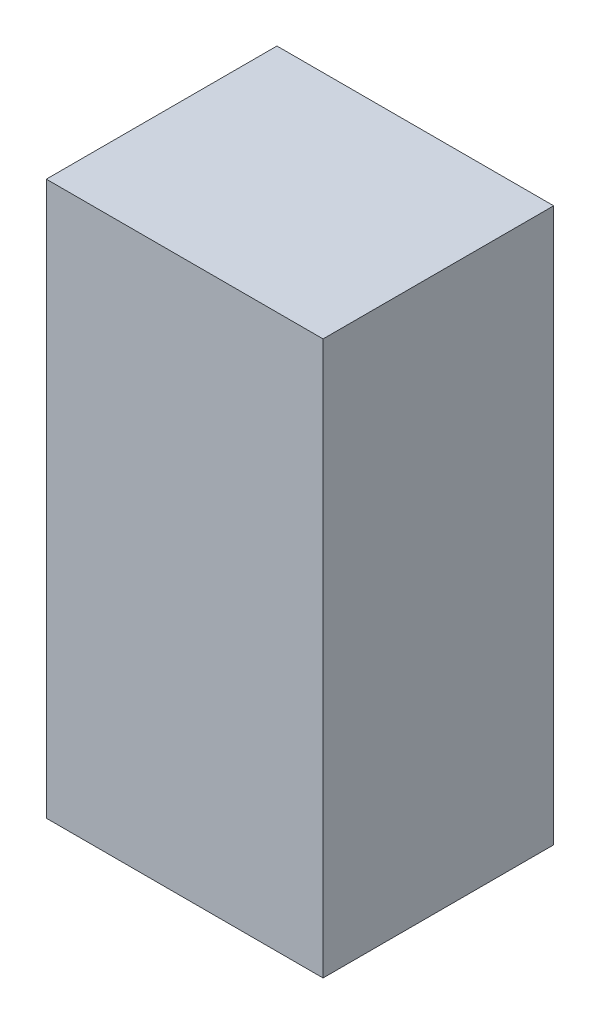
ISO-10303-21;
HEADER;
FILE_DESCRIPTION(('STEP AP214'),'2;1');
FILE_NAME('part.step','',(''),(''),'','','');
FILE_SCHEMA(('AUTOMOTIVE_DESIGN { 1 0 10303 214 1 1 1 1 }'));
ENDSEC;
DATA;
#1=APPLICATION_CONTEXT('core data for automotive mechanical design processes');
#2=APPLICATION_PROTOCOL_DEFINITION('international standard','automotive_design',2000,#1);
#3=PRODUCT_CONTEXT('',#1,'mechanical');
#4=PRODUCT('Part','Part','',(#3));
#5=PRODUCT_RELATED_PRODUCT_CATEGORY('part','',(#4));
#6=PRODUCT_DEFINITION_FORMATION('','',#4);
#7=PRODUCT_DEFINITION_CONTEXT('part definition',#1,'design');
#8=PRODUCT_DEFINITION('design','',#6,#7);
#9=PRODUCT_DEFINITION_SHAPE('','',#8);
#10=(LENGTH_UNIT() NAMED_UNIT(*) SI_UNIT(.MILLI.,.METRE.));
#11=(NAMED_UNIT(*) PLANE_ANGLE_UNIT() SI_UNIT($,.RADIAN.));
#12=(NAMED_UNIT(*) SI_UNIT($,.STERADIAN.) SOLID_ANGLE_UNIT());
#13=UNCERTAINTY_MEASURE_WITH_UNIT(LENGTH_MEASURE(1.E-05),#10,'distance_accuracy_value','');
#14=(GEOMETRIC_REPRESENTATION_CONTEXT(3) GLOBAL_UNCERTAINTY_ASSIGNED_CONTEXT((#13)) GLOBAL_UNIT_ASSIGNED_CONTEXT((#10,
#11,#12)) REPRESENTATION_CONTEXT('',''));
#15=CARTESIAN_POINT('',(0.,0.,0.));
#16=DIRECTION('',(0.,0.,1.));
#17=DIRECTION('',(1.,0.,0.));
#18=AXIS2_PLACEMENT_3D('',#15,#16,#17);
#19=CARTESIAN_POINT('',(-600.,-1200.,500.));
#20=DIRECTION('',(1.,0.,0.));
#21=DIRECTION('',(0.,0.,-1.));
#22=AXIS2_PLACEMENT_3D('',#19,#20,#21);
#23=PLANE('',#22);
#24=DIRECTION('',(0.,-1.,0.));
#25=VECTOR('',#24,1.);
#26=CARTESIAN_POINT('',(-600.,-1200.,-500.));
#27=LINE('',#26,#25);
#28=CARTESIAN_POINT('',(-600.,1200.,-500.));
#29=VERTEX_POINT('',#28);
#30=CARTESIAN_POINT('',(-600.,-1200.,-500.));
#31=VERTEX_POINT('',#30);
#32=EDGE_CURVE('E105',#29,#31,#27,.T.);
#33=ORIENTED_EDGE('',*,*,#32,.T.);
#34=DIRECTION('',(0.,0.,-1.));
#35=VECTOR('',#34,1.);
#36=CARTESIAN_POINT('',(-600.,-1200.,500.));
#37=LINE('',#36,#35);
#38=CARTESIAN_POINT('',(-600.,-1200.,500.));
#39=VERTEX_POINT('',#38);
#40=EDGE_CURVE('E11',#39,#31,#37,.T.);
#41=ORIENTED_EDGE('',*,*,#40,.F.);
#42=DIRECTION('',(0.,-1.,0.));
#43=VECTOR('',#42,1.);
#44=CARTESIAN_POINT('',(-600.,-1200.,500.));
#45=LINE('',#44,#43);
#46=CARTESIAN_POINT('',(-600.,1200.,500.));
#47=VERTEX_POINT('',#46);
#48=EDGE_CURVE('E89',#47,#39,#45,.T.);
#49=ORIENTED_EDGE('',*,*,#48,.F.);
#50=DIRECTION('',(0.,0.,-1.));
#51=VECTOR('',#50,1.);
#52=CARTESIAN_POINT('',(-600.,1200.,500.));
#53=LINE('',#52,#51);
#54=EDGE_CURVE('E98',#47,#29,#53,.T.);
#55=ORIENTED_EDGE('',*,*,#54,.T.);
#56=EDGE_LOOP('',(#33,#41,#49,#55));
#57=FACE_BOUND('',#56,.T.);
#58=ADVANCED_FACE('F39',(#57),#23,.F.);
#59=CARTESIAN_POINT('',(-600.,-1200.,500.));
#60=DIRECTION('',(0.,1.,0.));
#61=DIRECTION('',(0.,0.,1.));
#62=AXIS2_PLACEMENT_3D('',#59,#60,#61);
#63=PLANE('',#62);
#64=DIRECTION('',(1.,0.,0.));
#65=VECTOR('',#64,1.);
#66=CARTESIAN_POINT('',(-600.,-1200.,-500.));
#67=LINE('',#66,#65);
#68=CARTESIAN_POINT('',(600.,-1200.,-500.));
#69=VERTEX_POINT('',#68);
#70=EDGE_CURVE('E94',#31,#69,#67,.T.);
#71=ORIENTED_EDGE('',*,*,#70,.T.);
#72=DIRECTION('',(0.,0.,-1.));
#73=VECTOR('',#72,1.);
#74=CARTESIAN_POINT('',(600.,-1200.,500.));
#75=LINE('',#74,#73);
#76=CARTESIAN_POINT('',(600.,-1200.,500.));
#77=VERTEX_POINT('',#76);
#78=EDGE_CURVE('E50',#77,#69,#75,.T.);
#79=ORIENTED_EDGE('',*,*,#78,.F.);
#80=DIRECTION('',(1.,0.,0.));
#81=VECTOR('',#80,1.);
#82=CARTESIAN_POINT('',(-600.,-1200.,500.));
#83=LINE('',#82,#81);
#84=EDGE_CURVE('E83',#39,#77,#83,.T.);
#85=ORIENTED_EDGE('',*,*,#84,.F.);
#86=ORIENTED_EDGE('',*,*,#40,.T.);
#87=EDGE_LOOP('',(#71,#79,#85,#86));
#88=FACE_BOUND('',#87,.T.);
#89=ADVANCED_FACE('F91',(#88),#63,.F.);
#90=CARTESIAN_POINT('',(600.,-1200.,500.));
#91=DIRECTION('',(-1.,0.,0.));
#92=DIRECTION('',(0.,0.,1.));
#93=AXIS2_PLACEMENT_3D('',#90,#91,#92);
#94=PLANE('',#93);
#95=DIRECTION('',(0.,1.,0.));
#96=VECTOR('',#95,1.);
#97=CARTESIAN_POINT('',(600.,-1200.,-500.));
#98=LINE('',#97,#96);
#99=CARTESIAN_POINT('',(600.,1200.,-500.));
#100=VERTEX_POINT('',#99);
#101=EDGE_CURVE('E75',#69,#100,#98,.T.);
#102=ORIENTED_EDGE('',*,*,#101,.T.);
#103=DIRECTION('',(0.,0.,-1.));
#104=VECTOR('',#103,1.);
#105=CARTESIAN_POINT('',(600.,1200.,500.));
#106=LINE('',#105,#104);
#107=CARTESIAN_POINT('',(600.,1200.,500.));
#108=VERTEX_POINT('',#107);
#109=EDGE_CURVE('E92',#108,#100,#106,.T.);
#110=ORIENTED_EDGE('',*,*,#109,.F.);
#111=DIRECTION('',(0.,1.,0.));
#112=VECTOR('',#111,1.);
#113=CARTESIAN_POINT('',(600.,-1200.,500.));
#114=LINE('',#113,#112);
#115=EDGE_CURVE('E86',#77,#108,#114,.T.);
#116=ORIENTED_EDGE('',*,*,#115,.F.);
#117=ORIENTED_EDGE('',*,*,#78,.T.);
#118=EDGE_LOOP('',(#102,#110,#116,#117));
#119=FACE_BOUND('',#118,.T.);
#120=ADVANCED_FACE('F96',(#119),#94,.F.);
#121=CARTESIAN_POINT('',(-600.,1200.,500.));
#122=DIRECTION('',(0.,-1.,0.));
#123=DIRECTION('',(0.,0.,-1.));
#124=AXIS2_PLACEMENT_3D('',#121,#122,#123);
#125=PLANE('',#124);
#126=DIRECTION('',(-1.,0.,0.));
#127=VECTOR('',#126,1.);
#128=CARTESIAN_POINT('',(-600.,1200.,-500.));
#129=LINE('',#128,#127);
#130=EDGE_CURVE('E79',#100,#29,#129,.T.);
#131=ORIENTED_EDGE('',*,*,#130,.T.);
#132=ORIENTED_EDGE('',*,*,#54,.F.);
#133=DIRECTION('',(-1.,0.,0.));
#134=VECTOR('',#133,1.);
#135=CARTESIAN_POINT('',(-600.,1200.,500.));
#136=LINE('',#135,#134);
#137=EDGE_CURVE('E54',#108,#47,#136,.T.);
#138=ORIENTED_EDGE('',*,*,#137,.F.);
#139=ORIENTED_EDGE('',*,*,#109,.T.);
#140=EDGE_LOOP('',(#131,#132,#138,#139));
#141=FACE_BOUND('',#140,.T.);
#142=ADVANCED_FACE('F108',(#141),#125,.F.);
#143=CARTESIAN_POINT('',(0.,0.,500.));
#144=DIRECTION('',(0.,0.,-1.));
#145=DIRECTION('',(-1.,0.,0.));
#146=AXIS2_PLACEMENT_3D('',#143,#144,#145);
#147=PLANE('',#146);
#148=ORIENTED_EDGE('',*,*,#48,.T.);
#149=ORIENTED_EDGE('',*,*,#84,.T.);
#150=ORIENTED_EDGE('',*,*,#115,.T.);
#151=ORIENTED_EDGE('',*,*,#137,.T.);
#152=EDGE_LOOP('',(#148,#149,#150,#151));
#153=FACE_BOUND('',#152,.T.);
#154=ADVANCED_FACE('F88',(#153),#147,.F.);
#155=CARTESIAN_POINT('',(0.,0.,-500.));
#156=DIRECTION('',(0.,0.,-1.));
#157=DIRECTION('',(-1.,0.,0.));
#158=AXIS2_PLACEMENT_3D('',#155,#156,#157);
#159=PLANE('',#158);
#160=ORIENTED_EDGE('',*,*,#32,.F.);
#161=ORIENTED_EDGE('',*,*,#130,.F.);
#162=ORIENTED_EDGE('',*,*,#101,.F.);
#163=ORIENTED_EDGE('',*,*,#70,.F.);
#164=EDGE_LOOP('',(#160,#161,#162,#163));
#165=FACE_BOUND('',#164,.T.);
#166=ADVANCED_FACE('F115',(#165),#159,.T.);
#167=CLOSED_SHELL('',(#58,#89,#120,#142,#154,#166));
#168=MANIFOLD_SOLID_BREP('B2',#167);
#169=ADVANCED_BREP_SHAPE_REPRESENTATION('',(#18,#168),#14);
#170=SHAPE_DEFINITION_REPRESENTATION(#9,#169);
ENDSEC;
END-ISO-10303-21;
